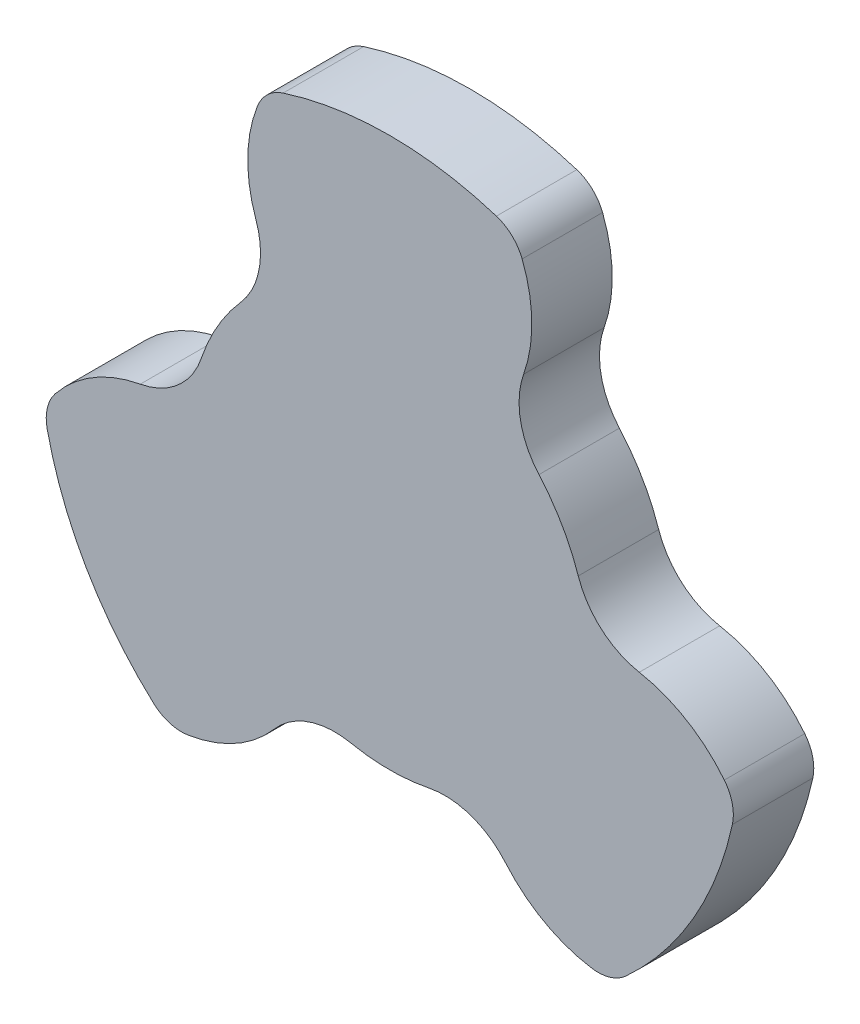
ISO-10303-21;
HEADER;
FILE_DESCRIPTION(('STEP AP214'),'2;1');
FILE_NAME('part.step','',(''),(''),'','','');
FILE_SCHEMA(('AUTOMOTIVE_DESIGN { 1 0 10303 214 1 1 1 1 }'));
ENDSEC;
DATA;
#1=APPLICATION_CONTEXT('core data for automotive mechanical design processes');
#2=APPLICATION_PROTOCOL_DEFINITION('international standard','automotive_design',2000,#1);
#3=PRODUCT_CONTEXT('',#1,'mechanical');
#4=PRODUCT('Part','Part','',(#3));
#5=PRODUCT_RELATED_PRODUCT_CATEGORY('part','',(#4));
#6=PRODUCT_DEFINITION_FORMATION('','',#4);
#7=PRODUCT_DEFINITION_CONTEXT('part definition',#1,'design');
#8=PRODUCT_DEFINITION('design','',#6,#7);
#9=PRODUCT_DEFINITION_SHAPE('','',#8);
#10=(LENGTH_UNIT() NAMED_UNIT(*) SI_UNIT(.MILLI.,.METRE.));
#11=(NAMED_UNIT(*) PLANE_ANGLE_UNIT() SI_UNIT($,.RADIAN.));
#12=(NAMED_UNIT(*) SI_UNIT($,.STERADIAN.) SOLID_ANGLE_UNIT());
#13=UNCERTAINTY_MEASURE_WITH_UNIT(LENGTH_MEASURE(1.E-05),#10,'distance_accuracy_value','');
#14=(GEOMETRIC_REPRESENTATION_CONTEXT(3) GLOBAL_UNCERTAINTY_ASSIGNED_CONTEXT((#13)) GLOBAL_UNIT_ASSIGNED_CONTEXT((#10,
#11,#12)) REPRESENTATION_CONTEXT('',''));
#15=CARTESIAN_POINT('',(0.,0.,0.));
#16=DIRECTION('',(0.,0.,1.));
#17=DIRECTION('',(1.,0.,0.));
#18=AXIS2_PLACEMENT_3D('',#15,#16,#17);
#19=CARTESIAN_POINT('',(17.9550527785572,-21.1043190536919,6.35));
#20=DIRECTION('',(0.,0.,-1.));
#21=DIRECTION('',(-1.,0.,0.));
#22=AXIS2_PLACEMENT_3D('',#19,#20,#21);
#23=CYLINDRICAL_SURFACE('',#22,6.2865);
#24=CARTESIAN_POINT('',(17.9550527785572,-21.1043190536919,0.));
#25=DIRECTION('',(0.,0.,1.));
#26=DIRECTION('',(1.,0.,0.));
#27=AXIS2_PLACEMENT_3D('',#24,#25,#26);
#28=CIRCLE('',#27,6.2865);
#29=CARTESIAN_POINT('',(19.0955836098733,-27.2864927549735,0.));
#30=VERTEX_POINT('',#29);
#31=CARTESIAN_POINT('',(23.9132782704228,-23.1092208562955,0.));
#32=VERTEX_POINT('',#31);
#33=EDGE_CURVE('E245',#30,#32,#28,.T.);
#34=ORIENTED_EDGE('',*,*,#33,.F.);
#35=DIRECTION('',(0.,0.,-1.));
#36=VECTOR('',#35,1.);
#37=CARTESIAN_POINT('',(19.0955836098733,-27.2864927549735,6.35));
#38=LINE('',#37,#36);
#39=CARTESIAN_POINT('',(19.0955836098733,-27.2864927549735,6.35));
#40=VERTEX_POINT('',#39);
#41=EDGE_CURVE('E11',#40,#30,#38,.T.);
#42=ORIENTED_EDGE('',*,*,#41,.F.);
#43=CARTESIAN_POINT('',(17.9550527785572,-21.1043190536919,6.35));
#44=DIRECTION('',(0.,0.,1.));
#45=DIRECTION('',(1.,0.,0.));
#46=AXIS2_PLACEMENT_3D('',#43,#44,#45);
#47=CIRCLE('',#46,6.2865);
#48=CARTESIAN_POINT('',(23.9132782704228,-23.1092208562955,6.35));
#49=VERTEX_POINT('',#48);
#50=EDGE_CURVE('E326',#40,#49,#47,.T.);
#51=ORIENTED_EDGE('',*,*,#50,.T.);
#52=DIRECTION('',(0.,0.,-1.));
#53=VECTOR('',#52,1.);
#54=CARTESIAN_POINT('',(23.9132782704228,-23.1092208562955,6.35));
#55=LINE('',#54,#53);
#56=EDGE_CURVE('E48',#49,#32,#55,.T.);
#57=ORIENTED_EDGE('',*,*,#56,.T.);
#58=EDGE_LOOP('',(#34,#42,#51,#57));
#59=FACE_BOUND('',#58,.T.);
#60=ADVANCED_FACE('F45',(#59),#23,.F.);
#61=CARTESIAN_POINT('',(21.1301062847261,-38.3144914988759,6.35));
#62=DIRECTION('',(0.,0.,-1.));
#63=DIRECTION('',(-1.,0.,0.));
#64=AXIS2_PLACEMENT_3D('',#61,#62,#63);
#65=CYLINDRICAL_SURFACE('',#64,11.2141000000001);
#66=CARTESIAN_POINT('',(21.1301062847261,-38.3144914988759,0.));
#67=DIRECTION('',(0.,0.,1.));
#68=DIRECTION('',(1.,0.,0.));
#69=AXIS2_PLACEMENT_3D('',#66,#67,#68);
#70=CIRCLE('',#69,11.2141000000001);
#71=CARTESIAN_POINT('',(12.3809762596504,-31.2995957324142,0.));
#72=VERTEX_POINT('',#71);
#73=EDGE_CURVE('E139',#30,#72,#70,.T.);
#74=ORIENTED_EDGE('',*,*,#73,.T.);
#75=DIRECTION('',(0.,0.,-1.));
#76=VECTOR('',#75,1.);
#77=CARTESIAN_POINT('',(12.3809762596504,-31.2995957324142,6.35));
#78=LINE('',#77,#76);
#79=CARTESIAN_POINT('',(12.3809762596504,-31.2995957324142,6.35));
#80=VERTEX_POINT('',#79);
#81=EDGE_CURVE('E55',#80,#72,#78,.T.);
#82=ORIENTED_EDGE('',*,*,#81,.F.);
#83=CARTESIAN_POINT('',(21.1301062847261,-38.3144914988759,6.35));
#84=DIRECTION('',(0.,0.,1.));
#85=DIRECTION('',(1.,0.,0.));
#86=AXIS2_PLACEMENT_3D('',#83,#84,#85);
#87=CIRCLE('',#86,11.2141000000001);
#88=EDGE_CURVE('E218',#40,#80,#87,.T.);
#89=ORIENTED_EDGE('',*,*,#88,.F.);
#90=ORIENTED_EDGE('',*,*,#41,.T.);
#91=EDGE_LOOP('',(#74,#82,#89,#90));
#92=FACE_BOUND('',#91,.T.);
#93=ADVANCED_FACE('F559',(#92),#65,.T.);
#94=CARTESIAN_POINT('',(14.9076219633811,-33.3254150081194,6.35));
#95=DIRECTION('',(0.,0.,-1.));
#96=DIRECTION('',(-1.,0.,0.));
#97=AXIS2_PLACEMENT_3D('',#94,#95,#96);
#98=CYLINDRICAL_SURFACE('',#97,3.2385);
#99=CARTESIAN_POINT('',(14.9076219633811,-33.3254150081194,0.));
#100=DIRECTION('',(0.,0.,1.));
#101=DIRECTION('',(1.,0.,0.));
#102=AXIS2_PLACEMENT_3D('',#99,#100,#101);
#103=CIRCLE('',#102,3.2385);
#104=CARTESIAN_POINT('',(11.7434876912703,-34.0154414989543,0.));
#105=VERTEX_POINT('',#104);
#106=EDGE_CURVE('E226',#72,#105,#103,.T.);
#107=ORIENTED_EDGE('',*,*,#106,.T.);
#108=DIRECTION('',(0.,0.,-1.));
#109=VECTOR('',#108,1.);
#110=CARTESIAN_POINT('',(11.7434876912703,-34.0154414989543,6.35));
#111=LINE('',#110,#109);
#112=CARTESIAN_POINT('',(11.7434876912703,-34.0154414989543,6.35));
#113=VERTEX_POINT('',#112);
#114=EDGE_CURVE('E223',#113,#105,#111,.T.);
#115=ORIENTED_EDGE('',*,*,#114,.F.);
#116=CARTESIAN_POINT('',(14.9076219633811,-33.3254150081194,6.35));
#117=DIRECTION('',(0.,0.,1.));
#118=DIRECTION('',(1.,0.,0.));
#119=AXIS2_PLACEMENT_3D('',#116,#117,#118);
#120=CIRCLE('',#119,3.2385);
#121=EDGE_CURVE('E212',#80,#113,#120,.T.);
#122=ORIENTED_EDGE('',*,*,#121,.F.);
#123=ORIENTED_EDGE('',*,*,#81,.T.);
#124=EDGE_LOOP('',(#107,#115,#122,#123));
#125=FACE_BOUND('',#124,.T.);
#126=ADVANCED_FACE('F224',(#125),#98,.T.);
#127=CARTESIAN_POINT('',(38.793733625394,-28.116391498876,6.35));
#128=DIRECTION('',(0.,0.,-1.));
#129=DIRECTION('',(-1.,0.,0.));
#130=AXIS2_PLACEMENT_3D('',#127,#128,#129);
#131=CYLINDRICAL_SURFACE('',#130,27.686);
#132=CARTESIAN_POINT('',(38.793733625394,-28.116391498876,0.));
#133=DIRECTION('',(0.,0.,1.));
#134=DIRECTION('',(1.,0.,0.));
#135=AXIS2_PLACEMENT_3D('',#132,#133,#134);
#136=CIRCLE('',#135,27.686);
#137=CARTESIAN_POINT('',(20.1598835000698,-48.5930666564047,0.));
#138=VERTEX_POINT('',#137);
#139=EDGE_CURVE('E320',#105,#138,#136,.T.);
#140=ORIENTED_EDGE('',*,*,#139,.T.);
#141=DIRECTION('',(0.,0.,-1.));
#142=VECTOR('',#141,1.);
#143=CARTESIAN_POINT('',(20.1598835000698,-48.5930666564047,6.35));
#144=LINE('',#143,#142);
#145=CARTESIAN_POINT('',(20.1598835000698,-48.5930666564047,6.35));
#146=VERTEX_POINT('',#145);
#147=EDGE_CURVE('E230',#146,#138,#144,.T.);
#148=ORIENTED_EDGE('',*,*,#147,.F.);
#149=CARTESIAN_POINT('',(38.793733625394,-28.116391498876,6.35));
#150=DIRECTION('',(0.,0.,1.));
#151=DIRECTION('',(1.,0.,0.));
#152=AXIS2_PLACEMENT_3D('',#149,#150,#151);
#153=CIRCLE('',#152,27.686);
#154=EDGE_CURVE('E216',#113,#146,#153,.T.);
#155=ORIENTED_EDGE('',*,*,#154,.F.);
#156=ORIENTED_EDGE('',*,*,#114,.T.);
#157=EDGE_LOOP('',(#140,#148,#155,#156));
#158=FACE_BOUND('',#157,.T.);
#159=ADVANCED_FACE('F232',(#158),#131,.T.);
#160=CARTESIAN_POINT('',(22.3395311064724,-46.1978592411892,6.35));
#161=DIRECTION('',(0.,0.,-1.));
#162=DIRECTION('',(-1.,0.,0.));
#163=AXIS2_PLACEMENT_3D('',#160,#161,#162);
#164=CYLINDRICAL_SURFACE('',#163,3.2385);
#165=CARTESIAN_POINT('',(22.3395311064724,-46.1978592411892,0.));
#166=DIRECTION('',(0.,0.,1.));
#167=DIRECTION('',(1.,0.,0.));
#168=AXIS2_PLACEMENT_3D('',#165,#166,#167);
#169=CIRCLE('',#168,3.2385);
#170=CARTESIAN_POINT('',(22.830619210844,-49.3989082448355,0.));
#171=VERTEX_POINT('',#170);
#172=EDGE_CURVE('E317',#138,#171,#169,.T.);
#173=ORIENTED_EDGE('',*,*,#172,.T.);
#174=DIRECTION('',(0.,0.,-1.));
#175=VECTOR('',#174,1.);
#176=CARTESIAN_POINT('',(22.830619210844,-49.3989082448355,6.35));
#177=LINE('',#176,#175);
#178=CARTESIAN_POINT('',(22.830619210844,-49.3989082448355,6.35));
#179=VERTEX_POINT('',#178);
#180=EDGE_CURVE('E332',#179,#171,#177,.T.);
#181=ORIENTED_EDGE('',*,*,#180,.F.);
#182=CARTESIAN_POINT('',(22.3395311064724,-46.1978592411892,6.35));
#183=DIRECTION('',(0.,0.,1.));
#184=DIRECTION('',(1.,0.,0.));
#185=AXIS2_PLACEMENT_3D('',#182,#183,#184);
#186=CIRCLE('',#185,3.2385);
#187=EDGE_CURVE('E236',#146,#179,#186,.T.);
#188=ORIENTED_EDGE('',*,*,#187,.F.);
#189=ORIENTED_EDGE('',*,*,#147,.T.);
#190=EDGE_LOOP('',(#173,#181,#188,#189));
#191=FACE_BOUND('',#190,.T.);
#192=ADVANCED_FACE('F406',(#191),#164,.T.);
#193=CARTESIAN_POINT('',(21.1301062847261,-38.3144914988759,6.35));
#194=DIRECTION('',(0.,0.,-1.));
#195=DIRECTION('',(-1.,0.,0.));
#196=AXIS2_PLACEMENT_3D('',#193,#194,#195);
#197=CYLINDRICAL_SURFACE('',#196,11.2141000000001);
#198=CARTESIAN_POINT('',(21.1301062847261,-38.3144914988759,0.));
#199=DIRECTION('',(0.,0.,1.));
#200=DIRECTION('',(1.,0.,0.));
#201=AXIS2_PLACEMENT_3D('',#198,#199,#200);
#202=CIRCLE('',#201,11.2141000000001);
#203=CARTESIAN_POINT('',(29.663372012422,-45.5904391918251,0.));
#204=VERTEX_POINT('',#203);
#205=EDGE_CURVE('E313',#171,#204,#202,.T.);
#206=ORIENTED_EDGE('',*,*,#205,.T.);
#207=DIRECTION('',(0.,0.,-1.));
#208=VECTOR('',#207,1.);
#209=CARTESIAN_POINT('',(29.663372012422,-45.5904391918251,6.35));
#210=LINE('',#209,#208);
#211=CARTESIAN_POINT('',(29.663372012422,-45.5904391918251,6.35));
#212=VERTEX_POINT('',#211);
#213=EDGE_CURVE('E336',#212,#204,#210,.T.);
#214=ORIENTED_EDGE('',*,*,#213,.F.);
#215=CARTESIAN_POINT('',(21.1301062847261,-38.3144914988759,6.35));
#216=DIRECTION('',(0.,0.,1.));
#217=DIRECTION('',(1.,0.,0.));
#218=AXIS2_PLACEMENT_3D('',#215,#216,#217);
#219=CIRCLE('',#218,11.2141000000001);
#220=EDGE_CURVE('E239',#179,#212,#219,.T.);
#221=ORIENTED_EDGE('',*,*,#220,.F.);
#222=ORIENTED_EDGE('',*,*,#180,.T.);
#223=EDGE_LOOP('',(#206,#214,#221,#222));
#224=FACE_BOUND('',#223,.T.);
#225=ADVANCED_FACE('F415',(#224),#197,.T.);
#226=CARTESIAN_POINT('',(34.4470260726819,-49.6692547161849,6.35));
#227=DIRECTION('',(0.,0.,-1.));
#228=DIRECTION('',(-1.,0.,0.));
#229=AXIS2_PLACEMENT_3D('',#226,#227,#228);
#230=CYLINDRICAL_SURFACE('',#229,6.28649999999999);
#231=CARTESIAN_POINT('',(34.4470260726819,-49.6692547161849,0.));
#232=DIRECTION('',(0.,0.,1.));
#233=DIRECTION('',(1.,0.,0.));
#234=AXIS2_PLACEMENT_3D('',#231,#232,#233);
#235=CIRCLE('',#234,6.28649999999999);
#236=CARTESIAN_POINT('',(35.6898429254668,-43.5068291774515,0.));
#237=VERTEX_POINT('',#236);
#238=EDGE_CURVE('E309',#237,#204,#235,.T.);
#239=ORIENTED_EDGE('',*,*,#238,.F.);
#240=DIRECTION('',(0.,0.,-1.));
#241=VECTOR('',#240,1.);
#242=CARTESIAN_POINT('',(35.6898429254668,-43.5068291774515,6.35));
#243=LINE('',#242,#241);
#244=CARTESIAN_POINT('',(35.6898429254668,-43.5068291774515,6.35));
#245=VERTEX_POINT('',#244);
#246=EDGE_CURVE('E339',#245,#237,#243,.T.);
#247=ORIENTED_EDGE('',*,*,#246,.F.);
#248=CARTESIAN_POINT('',(34.4470260726819,-49.6692547161849,6.35));
#249=DIRECTION('',(0.,0.,1.));
#250=DIRECTION('',(1.,0.,0.));
#251=AXIS2_PLACEMENT_3D('',#248,#249,#250);
#252=CIRCLE('',#251,6.28649999999999);
#253=EDGE_CURVE('E412',#245,#212,#252,.T.);
#254=ORIENTED_EDGE('',*,*,#253,.T.);
#255=ORIENTED_EDGE('',*,*,#213,.T.);
#256=EDGE_LOOP('',(#239,#247,#254,#255));
#257=FACE_BOUND('',#256,.T.);
#258=ADVANCED_FACE('F418',(#257),#230,.F.);
#259=CARTESIAN_POINT('',(38.793733625394,-28.116391498876,6.35));
#260=DIRECTION('',(0.,0.,-1.));
#261=DIRECTION('',(-1.,0.,0.));
#262=AXIS2_PLACEMENT_3D('',#259,#260,#261);
#263=CYLINDRICAL_SURFACE('',#262,15.700309214);
#264=CARTESIAN_POINT('',(38.793733625394,-28.116391498876,0.));
#265=DIRECTION('',(0.,0.,1.));
#266=DIRECTION('',(1.,0.,0.));
#267=AXIS2_PLACEMENT_3D('',#264,#265,#266);
#268=CIRCLE('',#267,15.700309214);
#269=CARTESIAN_POINT('',(41.8976243253214,-43.5068291774515,0.));
#270=VERTEX_POINT('',#269);
#271=EDGE_CURVE('E305',#237,#270,#268,.T.);
#272=ORIENTED_EDGE('',*,*,#271,.T.);
#273=DIRECTION('',(0.,0.,-1.));
#274=VECTOR('',#273,1.);
#275=CARTESIAN_POINT('',(41.8976243253214,-43.5068291774515,6.35));
#276=LINE('',#275,#274);
#277=CARTESIAN_POINT('',(41.8976243253214,-43.5068291774515,6.35));
#278=VERTEX_POINT('',#277);
#279=EDGE_CURVE('E342',#278,#270,#276,.T.);
#280=ORIENTED_EDGE('',*,*,#279,.F.);
#281=CARTESIAN_POINT('',(38.793733625394,-28.116391498876,6.35));
#282=DIRECTION('',(0.,0.,1.));
#283=DIRECTION('',(1.,0.,0.));
#284=AXIS2_PLACEMENT_3D('',#281,#282,#283);
#285=CIRCLE('',#284,15.700309214);
#286=EDGE_CURVE('E421',#245,#278,#285,.T.);
#287=ORIENTED_EDGE('',*,*,#286,.F.);
#288=ORIENTED_EDGE('',*,*,#246,.T.);
#289=EDGE_LOOP('',(#272,#280,#287,#288));
#290=FACE_BOUND('',#289,.T.);
#291=ADVANCED_FACE('F548',(#290),#263,.T.);
#292=CARTESIAN_POINT('',(43.1404411781063,-49.6692547161849,6.35));
#293=DIRECTION('',(0.,0.,-1.));
#294=DIRECTION('',(-1.,0.,0.));
#295=AXIS2_PLACEMENT_3D('',#292,#293,#294);
#296=CYLINDRICAL_SURFACE('',#295,6.2865);
#297=CARTESIAN_POINT('',(43.1404411781063,-49.6692547161849,0.));
#298=DIRECTION('',(0.,0.,1.));
#299=DIRECTION('',(1.,0.,0.));
#300=AXIS2_PLACEMENT_3D('',#297,#298,#299);
#301=CIRCLE('',#300,6.2865);
#302=CARTESIAN_POINT('',(47.9240952383662,-45.590439191825,0.));
#303=VERTEX_POINT('',#302);
#304=EDGE_CURVE('E301',#303,#270,#301,.T.);
#305=ORIENTED_EDGE('',*,*,#304,.F.);
#306=DIRECTION('',(0.,0.,-1.));
#307=VECTOR('',#306,1.);
#308=CARTESIAN_POINT('',(47.9240952383662,-45.590439191825,6.35));
#309=LINE('',#308,#307);
#310=CARTESIAN_POINT('',(47.9240952383662,-45.590439191825,6.35));
#311=VERTEX_POINT('',#310);
#312=EDGE_CURVE('E345',#311,#303,#309,.T.);
#313=ORIENTED_EDGE('',*,*,#312,.F.);
#314=CARTESIAN_POINT('',(43.1404411781063,-49.6692547161849,6.35));
#315=DIRECTION('',(0.,0.,1.));
#316=DIRECTION('',(1.,0.,0.));
#317=AXIS2_PLACEMENT_3D('',#314,#315,#316);
#318=CIRCLE('',#317,6.2865);
#319=EDGE_CURVE('E424',#311,#278,#318,.T.);
#320=ORIENTED_EDGE('',*,*,#319,.T.);
#321=ORIENTED_EDGE('',*,*,#279,.T.);
#322=EDGE_LOOP('',(#305,#313,#320,#321));
#323=FACE_BOUND('',#322,.T.);
#324=ADVANCED_FACE('F543',(#323),#296,.F.);
#325=CARTESIAN_POINT('',(56.4573609660622,-38.3144914988759,6.35));
#326=DIRECTION('',(0.,0.,-1.));
#327=DIRECTION('',(-1.,0.,0.));
#328=AXIS2_PLACEMENT_3D('',#325,#326,#327);
#329=CYLINDRICAL_SURFACE('',#328,11.2141000000001);
#330=CARTESIAN_POINT('',(56.4573609660622,-38.3144914988759,0.));
#331=DIRECTION('',(0.,0.,1.));
#332=DIRECTION('',(1.,0.,0.));
#333=AXIS2_PLACEMENT_3D('',#330,#331,#332);
#334=CIRCLE('',#333,11.2141000000001);
#335=CARTESIAN_POINT('',(54.756848039944,-49.3989082448354,0.));
#336=VERTEX_POINT('',#335);
#337=EDGE_CURVE('E298',#303,#336,#334,.T.);
#338=ORIENTED_EDGE('',*,*,#337,.T.);
#339=DIRECTION('',(0.,0.,-1.));
#340=VECTOR('',#339,1.);
#341=CARTESIAN_POINT('',(54.756848039944,-49.3989082448354,6.35));
#342=LINE('',#341,#340);
#343=CARTESIAN_POINT('',(54.756848039944,-49.3989082448354,6.35));
#344=VERTEX_POINT('',#343);
#345=EDGE_CURVE('E348',#344,#336,#342,.T.);
#346=ORIENTED_EDGE('',*,*,#345,.F.);
#347=CARTESIAN_POINT('',(56.4573609660622,-38.3144914988759,6.35));
#348=DIRECTION('',(0.,0.,1.));
#349=DIRECTION('',(1.,0.,0.));
#350=AXIS2_PLACEMENT_3D('',#347,#348,#349);
#351=CIRCLE('',#350,11.2141000000001);
#352=EDGE_CURVE('E430',#311,#344,#351,.T.);
#353=ORIENTED_EDGE('',*,*,#352,.F.);
#354=ORIENTED_EDGE('',*,*,#312,.T.);
#355=EDGE_LOOP('',(#338,#346,#353,#354));
#356=FACE_BOUND('',#355,.T.);
#357=ADVANCED_FACE('F549',(#356),#329,.T.);
#358=CARTESIAN_POINT('',(55.2479361443156,-46.1978592411892,6.35));
#359=DIRECTION('',(0.,0.,-1.));
#360=DIRECTION('',(-1.,0.,0.));
#361=AXIS2_PLACEMENT_3D('',#358,#359,#360);
#362=CYLINDRICAL_SURFACE('',#361,3.23849999999998);
#363=CARTESIAN_POINT('',(55.2479361443156,-46.1978592411892,0.));
#364=DIRECTION('',(0.,0.,1.));
#365=DIRECTION('',(1.,0.,0.));
#366=AXIS2_PLACEMENT_3D('',#363,#364,#365);
#367=CIRCLE('',#366,3.23849999999998);
#368=CARTESIAN_POINT('',(57.4275837507182,-48.5930666564047,0.));
#369=VERTEX_POINT('',#368);
#370=EDGE_CURVE('E295',#336,#369,#367,.T.);
#371=ORIENTED_EDGE('',*,*,#370,.T.);
#372=DIRECTION('',(0.,0.,-1.));
#373=VECTOR('',#372,1.);
#374=CARTESIAN_POINT('',(57.4275837507182,-48.5930666564047,6.35));
#375=LINE('',#374,#373);
#376=CARTESIAN_POINT('',(57.4275837507182,-48.5930666564047,6.35));
#377=VERTEX_POINT('',#376);
#378=EDGE_CURVE('E352',#377,#369,#375,.T.);
#379=ORIENTED_EDGE('',*,*,#378,.F.);
#380=CARTESIAN_POINT('',(55.2479361443156,-46.1978592411892,6.35));
#381=DIRECTION('',(0.,0.,1.));
#382=DIRECTION('',(1.,0.,0.));
#383=AXIS2_PLACEMENT_3D('',#380,#381,#382);
#384=CIRCLE('',#383,3.23849999999998);
#385=EDGE_CURVE('E433',#344,#377,#384,.T.);
#386=ORIENTED_EDGE('',*,*,#385,.F.);
#387=ORIENTED_EDGE('',*,*,#345,.T.);
#388=EDGE_LOOP('',(#371,#379,#386,#387));
#389=FACE_BOUND('',#388,.T.);
#390=ADVANCED_FACE('F536',(#389),#362,.T.);
#391=CARTESIAN_POINT('',(38.793733625394,-28.116391498876,6.35));
#392=DIRECTION('',(0.,0.,-1.));
#393=DIRECTION('',(-1.,0.,0.));
#394=AXIS2_PLACEMENT_3D('',#391,#392,#393);
#395=CYLINDRICAL_SURFACE('',#394,27.686);
#396=CARTESIAN_POINT('',(38.793733625394,-28.116391498876,0.));
#397=DIRECTION('',(0.,0.,1.));
#398=DIRECTION('',(1.,0.,0.));
#399=AXIS2_PLACEMENT_3D('',#396,#397,#398);
#400=CIRCLE('',#399,27.686);
#401=CARTESIAN_POINT('',(65.8439795595178,-34.015441498954,0.));
#402=VERTEX_POINT('',#401);
#403=EDGE_CURVE('E292',#369,#402,#400,.T.);
#404=ORIENTED_EDGE('',*,*,#403,.T.);
#405=DIRECTION('',(0.,0.,-1.));
#406=VECTOR('',#405,1.);
#407=CARTESIAN_POINT('',(65.8439795595178,-34.015441498954,6.35));
#408=LINE('',#407,#406);
#409=CARTESIAN_POINT('',(65.8439795595178,-34.015441498954,6.35));
#410=VERTEX_POINT('',#409);
#411=EDGE_CURVE('E356',#410,#402,#408,.T.);
#412=ORIENTED_EDGE('',*,*,#411,.F.);
#413=CARTESIAN_POINT('',(38.793733625394,-28.116391498876,6.35));
#414=DIRECTION('',(0.,0.,1.));
#415=DIRECTION('',(1.,0.,0.));
#416=AXIS2_PLACEMENT_3D('',#413,#414,#415);
#417=CIRCLE('',#416,27.686);
#418=EDGE_CURVE('E436',#377,#410,#417,.T.);
#419=ORIENTED_EDGE('',*,*,#418,.F.);
#420=ORIENTED_EDGE('',*,*,#378,.T.);
#421=EDGE_LOOP('',(#404,#412,#419,#420));
#422=FACE_BOUND('',#421,.T.);
#423=ADVANCED_FACE('F532',(#422),#395,.T.);
#424=CARTESIAN_POINT('',(62.6798452874069,-33.3254150081192,6.35));
#425=DIRECTION('',(0.,0.,-1.));
#426=DIRECTION('',(-1.,0.,0.));
#427=AXIS2_PLACEMENT_3D('',#424,#425,#426);
#428=CYLINDRICAL_SURFACE('',#427,3.23849999999999);
#429=CARTESIAN_POINT('',(62.6798452874069,-33.3254150081192,0.));
#430=DIRECTION('',(0.,0.,1.));
#431=DIRECTION('',(1.,0.,0.));
#432=AXIS2_PLACEMENT_3D('',#429,#430,#431);
#433=CIRCLE('',#432,3.23849999999999);
#434=CARTESIAN_POINT('',(65.2064909911376,-31.2995957324139,0.));
#435=VERTEX_POINT('',#434);
#436=EDGE_CURVE('E289',#402,#435,#433,.T.);
#437=ORIENTED_EDGE('',*,*,#436,.T.);
#438=DIRECTION('',(0.,0.,-1.));
#439=VECTOR('',#438,1.);
#440=CARTESIAN_POINT('',(65.2064909911376,-31.2995957324139,6.35));
#441=LINE('',#440,#439);
#442=CARTESIAN_POINT('',(65.2064909911376,-31.2995957324139,6.35));
#443=VERTEX_POINT('',#442);
#444=EDGE_CURVE('E360',#443,#435,#441,.T.);
#445=ORIENTED_EDGE('',*,*,#444,.F.);
#446=CARTESIAN_POINT('',(62.6798452874069,-33.3254150081192,6.35));
#447=DIRECTION('',(0.,0.,1.));
#448=DIRECTION('',(1.,0.,0.));
#449=AXIS2_PLACEMENT_3D('',#446,#447,#448);
#450=CIRCLE('',#449,3.23849999999999);
#451=EDGE_CURVE('E439',#410,#443,#450,.T.);
#452=ORIENTED_EDGE('',*,*,#451,.F.);
#453=ORIENTED_EDGE('',*,*,#411,.T.);
#454=EDGE_LOOP('',(#437,#445,#452,#453));
#455=FACE_BOUND('',#454,.T.);
#456=ADVANCED_FACE('F527',(#455),#428,.T.);
#457=CARTESIAN_POINT('',(56.4573609660622,-38.3144914988759,6.35));
#458=DIRECTION('',(0.,0.,-1.));
#459=DIRECTION('',(-1.,0.,0.));
#460=AXIS2_PLACEMENT_3D('',#457,#458,#459);
#461=CYLINDRICAL_SURFACE('',#460,11.2141000000001);
#462=CARTESIAN_POINT('',(56.4573609660622,-38.3144914988759,0.));
#463=DIRECTION('',(0.,0.,1.));
#464=DIRECTION('',(1.,0.,0.));
#465=AXIS2_PLACEMENT_3D('',#462,#463,#464);
#466=CIRCLE('',#465,11.2141000000001);
#467=CARTESIAN_POINT('',(58.4918836409148,-27.2864927549735,0.));
#468=VERTEX_POINT('',#467);
#469=EDGE_CURVE('E285',#435,#468,#466,.T.);
#470=ORIENTED_EDGE('',*,*,#469,.T.);
#471=DIRECTION('',(0.,0.,-1.));
#472=VECTOR('',#471,1.);
#473=CARTESIAN_POINT('',(58.4918836409148,-27.2864927549735,6.35));
#474=LINE('',#473,#472);
#475=CARTESIAN_POINT('',(58.4918836409148,-27.2864927549735,6.35));
#476=VERTEX_POINT('',#475);
#477=EDGE_CURVE('E364',#476,#468,#474,.T.);
#478=ORIENTED_EDGE('',*,*,#477,.F.);
#479=CARTESIAN_POINT('',(56.4573609660622,-38.3144914988759,6.35));
#480=DIRECTION('',(0.,0.,1.));
#481=DIRECTION('',(1.,0.,0.));
#482=AXIS2_PLACEMENT_3D('',#479,#480,#481);
#483=CIRCLE('',#482,11.2141000000001);
#484=EDGE_CURVE('E442',#443,#476,#483,.T.);
#485=ORIENTED_EDGE('',*,*,#484,.F.);
#486=ORIENTED_EDGE('',*,*,#444,.T.);
#487=EDGE_LOOP('',(#470,#478,#485,#486));
#488=FACE_BOUND('',#487,.T.);
#489=ADVANCED_FACE('F521',(#488),#461,.T.);
#490=CARTESIAN_POINT('',(59.6324144722308,-21.1043190536919,6.35));
#491=DIRECTION('',(0.,0.,-1.));
#492=DIRECTION('',(-1.,0.,0.));
#493=AXIS2_PLACEMENT_3D('',#490,#491,#492);
#494=CYLINDRICAL_SURFACE('',#493,6.2865);
#495=CARTESIAN_POINT('',(59.6324144722308,-21.1043190536919,0.));
#496=DIRECTION('',(0.,0.,1.));
#497=DIRECTION('',(1.,0.,0.));
#498=AXIS2_PLACEMENT_3D('',#495,#496,#497);
#499=CIRCLE('',#498,6.2865);
#500=CARTESIAN_POINT('',(53.6741889803653,-23.1092208562955,0.));
#501=VERTEX_POINT('',#500);
#502=EDGE_CURVE('E281',#501,#468,#499,.T.);
#503=ORIENTED_EDGE('',*,*,#502,.F.);
#504=DIRECTION('',(0.,0.,-1.));
#505=VECTOR('',#504,1.);
#506=CARTESIAN_POINT('',(53.6741889803653,-23.1092208562955,6.35));
#507=LINE('',#506,#505);
#508=CARTESIAN_POINT('',(53.6741889803653,-23.1092208562955,6.35));
#509=VERTEX_POINT('',#508);
#510=EDGE_CURVE('E367',#509,#501,#507,.T.);
#511=ORIENTED_EDGE('',*,*,#510,.F.);
#512=CARTESIAN_POINT('',(59.6324144722308,-21.1043190536919,6.35));
#513=DIRECTION('',(0.,0.,1.));
#514=DIRECTION('',(1.,0.,0.));
#515=AXIS2_PLACEMENT_3D('',#512,#513,#514);
#516=CIRCLE('',#515,6.2865);
#517=EDGE_CURVE('E445',#509,#476,#516,.T.);
#518=ORIENTED_EDGE('',*,*,#517,.T.);
#519=ORIENTED_EDGE('',*,*,#477,.T.);
#520=EDGE_LOOP('',(#503,#511,#518,#519));
#521=FACE_BOUND('',#520,.T.);
#522=ADVANCED_FACE('F516',(#521),#494,.F.);
#523=CARTESIAN_POINT('',(38.793733625394,-28.116391498876,6.35));
#524=DIRECTION('',(0.,0.,-1.));
#525=DIRECTION('',(-1.,0.,0.));
#526=AXIS2_PLACEMENT_3D('',#523,#524,#525);
#527=CYLINDRICAL_SURFACE('',#526,15.700309214);
#528=CARTESIAN_POINT('',(38.793733625394,-28.116391498876,0.));
#529=DIRECTION('',(0.,0.,1.));
#530=DIRECTION('',(1.,0.,0.));
#531=AXIS2_PLACEMENT_3D('',#528,#529,#530);
#532=CIRCLE('',#531,15.700309214);
#533=CARTESIAN_POINT('',(50.5702982804379,-17.7331244628809,0.));
#534=VERTEX_POINT('',#533);
#535=EDGE_CURVE('E277',#501,#534,#532,.T.);
#536=ORIENTED_EDGE('',*,*,#535,.T.);
#537=DIRECTION('',(0.,0.,-1.));
#538=VECTOR('',#537,1.);
#539=CARTESIAN_POINT('',(50.5702982804379,-17.7331244628809,6.35));
#540=LINE('',#539,#538);
#541=CARTESIAN_POINT('',(50.5702982804379,-17.7331244628809,6.35));
#542=VERTEX_POINT('',#541);
#543=EDGE_CURVE('E370',#542,#534,#540,.T.);
#544=ORIENTED_EDGE('',*,*,#543,.F.);
#545=CARTESIAN_POINT('',(38.793733625394,-28.116391498876,6.35));
#546=DIRECTION('',(0.,0.,1.));
#547=DIRECTION('',(1.,0.,0.));
#548=AXIS2_PLACEMENT_3D('',#545,#546,#547);
#549=CIRCLE('',#548,15.700309214);
#550=EDGE_CURVE('E449',#509,#542,#549,.T.);
#551=ORIENTED_EDGE('',*,*,#550,.F.);
#552=ORIENTED_EDGE('',*,*,#510,.T.);
#553=EDGE_LOOP('',(#536,#544,#551,#552));
#554=FACE_BOUND('',#553,.T.);
#555=ADVANCED_FACE('F512',(#554),#527,.T.);
#556=CARTESIAN_POINT('',(55.2857069195186,-13.575600726751,6.35));
#557=DIRECTION('',(0.,0.,-1.));
#558=DIRECTION('',(-1.,0.,0.));
#559=AXIS2_PLACEMENT_3D('',#556,#557,#558);
#560=CYLINDRICAL_SURFACE('',#559,6.2865);
#561=CARTESIAN_POINT('',(55.2857069195186,-13.575600726751,0.));
#562=DIRECTION('',(0.,0.,1.));
#563=DIRECTION('',(1.,0.,0.));
#564=AXIS2_PLACEMENT_3D('',#561,#562,#563);
#565=CIRCLE('',#564,6.2865);
#566=CARTESIAN_POINT('',(49.3615220279426,-11.4722425498293,0.));
#567=VERTEX_POINT('',#566);
#568=EDGE_CURVE('E273',#567,#534,#565,.T.);
#569=ORIENTED_EDGE('',*,*,#568,.F.);
#570=DIRECTION('',(0.,0.,-1.));
#571=VECTOR('',#570,1.);
#572=CARTESIAN_POINT('',(49.3615220279426,-11.4722425498293,6.35));
#573=LINE('',#572,#571);
#574=CARTESIAN_POINT('',(49.3615220279426,-11.4722425498293,6.35));
#575=VERTEX_POINT('',#574);
#576=EDGE_CURVE('E373',#575,#567,#573,.T.);
#577=ORIENTED_EDGE('',*,*,#576,.F.);
#578=CARTESIAN_POINT('',(55.2857069195186,-13.575600726751,6.35));
#579=DIRECTION('',(0.,0.,1.));
#580=DIRECTION('',(1.,0.,0.));
#581=AXIS2_PLACEMENT_3D('',#578,#579,#580);
#582=CIRCLE('',#581,6.2865);
#583=EDGE_CURVE('E452',#575,#542,#582,.T.);
#584=ORIENTED_EDGE('',*,*,#583,.T.);
#585=ORIENTED_EDGE('',*,*,#543,.T.);
#586=EDGE_LOOP('',(#569,#577,#584,#585));
#587=FACE_BOUND('',#586,.T.);
#588=ADVANCED_FACE('F506',(#587),#560,.F.);
#589=CARTESIAN_POINT('',(38.793733625394,-7.72019149887598,6.35));
#590=DIRECTION('',(0.,0.,-1.));
#591=DIRECTION('',(-1.,0.,0.));
#592=AXIS2_PLACEMENT_3D('',#589,#590,#591);
#593=CYLINDRICAL_SURFACE('',#592,11.2141);
#594=CARTESIAN_POINT('',(38.793733625394,-7.72019149887598,0.));
#595=DIRECTION('',(0.,0.,1.));
#596=DIRECTION('',(1.,0.,0.));
#597=AXIS2_PLACEMENT_3D('',#594,#595,#596);
#598=CIRCLE('',#597,11.2141);
#599=CARTESIAN_POINT('',(49.2433765765876,-3.6506705193784,0.));
#600=VERTEX_POINT('',#599);
#601=EDGE_CURVE('E270',#567,#600,#598,.T.);
#602=ORIENTED_EDGE('',*,*,#601,.T.);
#603=DIRECTION('',(0.,0.,-1.));
#604=VECTOR('',#603,1.);
#605=CARTESIAN_POINT('',(49.2433765765876,-3.6506705193784,6.35));
#606=LINE('',#605,#604);
#607=CARTESIAN_POINT('',(49.2433765765876,-3.6506705193784,6.35));
#608=VERTEX_POINT('',#607);
#609=EDGE_CURVE('E376',#608,#600,#606,.T.);
#610=ORIENTED_EDGE('',*,*,#609,.F.);
#611=CARTESIAN_POINT('',(38.793733625394,-7.72019149887598,6.35));
#612=DIRECTION('',(0.,0.,1.));
#613=DIRECTION('',(1.,0.,0.));
#614=AXIS2_PLACEMENT_3D('',#611,#612,#613);
#615=CIRCLE('',#614,11.2141);
#616=EDGE_CURVE('E456',#575,#608,#615,.T.);
#617=ORIENTED_EDGE('',*,*,#616,.F.);
#618=ORIENTED_EDGE('',*,*,#576,.T.);
#619=EDGE_LOOP('',(#602,#610,#617,#618));
#620=FACE_BOUND('',#619,.T.);
#621=ADVANCED_FACE('F649',(#620),#593,.T.);
#622=CARTESIAN_POINT('',(46.2256427684853,-4.82590024731938,6.35));
#623=DIRECTION('',(0.,0.,-1.));
#624=DIRECTION('',(-1.,0.,0.));
#625=AXIS2_PLACEMENT_3D('',#622,#623,#624);
#626=CYLINDRICAL_SURFACE('',#625,3.23850000000001);
#627=CARTESIAN_POINT('',(46.2256427684853,-4.82590024731938,0.));
#628=DIRECTION('',(0.,0.,1.));
#629=DIRECTION('',(1.,0.,0.));
#630=AXIS2_PLACEMENT_3D('',#627,#628,#629);
#631=CIRCLE('',#630,3.23850000000001);
#632=CARTESIAN_POINT('',(47.2101294341934,-1.74066634126901,0.));
#633=VERTEX_POINT('',#632);
#634=EDGE_CURVE('E267',#600,#633,#631,.T.);
#635=ORIENTED_EDGE('',*,*,#634,.T.);
#636=DIRECTION('',(0.,0.,-1.));
#637=VECTOR('',#636,1.);
#638=CARTESIAN_POINT('',(47.2101294341934,-1.74066634126901,6.35));
#639=LINE('',#638,#637);
#640=CARTESIAN_POINT('',(47.2101294341934,-1.74066634126901,6.35));
#641=VERTEX_POINT('',#640);
#642=EDGE_CURVE('E380',#641,#633,#639,.T.);
#643=ORIENTED_EDGE('',*,*,#642,.F.);
#644=CARTESIAN_POINT('',(46.2256427684853,-4.82590024731938,6.35));
#645=DIRECTION('',(0.,0.,1.));
#646=DIRECTION('',(1.,0.,0.));
#647=AXIS2_PLACEMENT_3D('',#644,#645,#646);
#648=CIRCLE('',#647,3.23850000000001);
#649=EDGE_CURVE('E459',#608,#641,#648,.T.);
#650=ORIENTED_EDGE('',*,*,#649,.F.);
#651=ORIENTED_EDGE('',*,*,#609,.T.);
#652=EDGE_LOOP('',(#635,#643,#650,#651));
#653=FACE_BOUND('',#652,.T.);
#654=ADVANCED_FACE('F499',(#653),#626,.T.);
#655=CARTESIAN_POINT('',(38.793733625394,-28.116391498876,6.35));
#656=DIRECTION('',(0.,0.,-1.));
#657=DIRECTION('',(-1.,0.,0.));
#658=AXIS2_PLACEMENT_3D('',#655,#656,#657);
#659=CYLINDRICAL_SURFACE('',#658,27.686);
#660=CARTESIAN_POINT('',(38.793733625394,-28.116391498876,0.));
#661=DIRECTION('',(0.,0.,1.));
#662=DIRECTION('',(1.,0.,0.));
#663=AXIS2_PLACEMENT_3D('',#660,#661,#662);
#664=CIRCLE('',#663,27.686);
#665=CARTESIAN_POINT('',(30.3773378165946,-1.74066634126901,0.));
#666=VERTEX_POINT('',#665);
#667=EDGE_CURVE('E264',#633,#666,#664,.T.);
#668=ORIENTED_EDGE('',*,*,#667,.T.);
#669=DIRECTION('',(0.,0.,-1.));
#670=VECTOR('',#669,1.);
#671=CARTESIAN_POINT('',(30.3773378165946,-1.74066634126901,6.35));
#672=LINE('',#671,#670);
#673=CARTESIAN_POINT('',(30.3773378165946,-1.74066634126901,6.35));
#674=VERTEX_POINT('',#673);
#675=EDGE_CURVE('E384',#674,#666,#672,.T.);
#676=ORIENTED_EDGE('',*,*,#675,.F.);
#677=CARTESIAN_POINT('',(38.793733625394,-28.116391498876,6.35));
#678=DIRECTION('',(0.,0.,1.));
#679=DIRECTION('',(1.,0.,0.));
#680=AXIS2_PLACEMENT_3D('',#677,#678,#679);
#681=CIRCLE('',#680,27.686);
#682=EDGE_CURVE('E462',#641,#674,#681,.T.);
#683=ORIENTED_EDGE('',*,*,#682,.F.);
#684=ORIENTED_EDGE('',*,*,#642,.T.);
#685=EDGE_LOOP('',(#668,#676,#683,#684));
#686=FACE_BOUND('',#685,.T.);
#687=ADVANCED_FACE('F495',(#686),#659,.T.);
#688=CARTESIAN_POINT('',(31.3618244823028,-4.82590024731938,6.35));
#689=DIRECTION('',(0.,0.,-1.));
#690=DIRECTION('',(-1.,0.,0.));
#691=AXIS2_PLACEMENT_3D('',#688,#689,#690);
#692=CYLINDRICAL_SURFACE('',#691,3.23850000000001);
#693=CARTESIAN_POINT('',(31.3618244823028,-4.82590024731938,0.));
#694=DIRECTION('',(0.,0.,1.));
#695=DIRECTION('',(1.,0.,0.));
#696=AXIS2_PLACEMENT_3D('',#693,#694,#695);
#697=CIRCLE('',#696,3.23850000000001);
#698=CARTESIAN_POINT('',(28.3440906742004,-3.6506705193784,0.));
#699=VERTEX_POINT('',#698);
#700=EDGE_CURVE('E261',#666,#699,#697,.T.);
#701=ORIENTED_EDGE('',*,*,#700,.T.);
#702=DIRECTION('',(0.,0.,-1.));
#703=VECTOR('',#702,1.);
#704=CARTESIAN_POINT('',(28.3440906742004,-3.6506705193784,6.35));
#705=LINE('',#704,#703);
#706=CARTESIAN_POINT('',(28.3440906742004,-3.6506705193784,6.35));
#707=VERTEX_POINT('',#706);
#708=EDGE_CURVE('E388',#707,#699,#705,.T.);
#709=ORIENTED_EDGE('',*,*,#708,.F.);
#710=CARTESIAN_POINT('',(31.3618244823028,-4.82590024731938,6.35));
#711=DIRECTION('',(0.,0.,1.));
#712=DIRECTION('',(1.,0.,0.));
#713=AXIS2_PLACEMENT_3D('',#710,#711,#712);
#714=CIRCLE('',#713,3.23850000000001);
#715=EDGE_CURVE('E465',#674,#707,#714,.T.);
#716=ORIENTED_EDGE('',*,*,#715,.F.);
#717=ORIENTED_EDGE('',*,*,#675,.T.);
#718=EDGE_LOOP('',(#701,#709,#716,#717));
#719=FACE_BOUND('',#718,.T.);
#720=ADVANCED_FACE('F491',(#719),#692,.T.);
#721=CARTESIAN_POINT('',(38.793733625394,-7.72019149887598,6.35));
#722=DIRECTION('',(0.,0.,-1.));
#723=DIRECTION('',(-1.,0.,0.));
#724=AXIS2_PLACEMENT_3D('',#721,#722,#723);
#725=CYLINDRICAL_SURFACE('',#724,11.2141);
#726=CARTESIAN_POINT('',(38.793733625394,-7.72019149887598,0.));
#727=DIRECTION('',(0.,0.,1.));
#728=DIRECTION('',(1.,0.,0.));
#729=AXIS2_PLACEMENT_3D('',#726,#727,#728);
#730=CIRCLE('',#729,11.2141);
#731=CARTESIAN_POINT('',(28.2259452228454,-11.4722425498293,0.));
#732=VERTEX_POINT('',#731);
#733=EDGE_CURVE('E257',#699,#732,#730,.T.);
#734=ORIENTED_EDGE('',*,*,#733,.T.);
#735=DIRECTION('',(0.,0.,-1.));
#736=VECTOR('',#735,1.);
#737=CARTESIAN_POINT('',(28.2259452228454,-11.4722425498293,6.35));
#738=LINE('',#737,#736);
#739=CARTESIAN_POINT('',(28.2259452228454,-11.4722425498293,6.35));
#740=VERTEX_POINT('',#739);
#741=EDGE_CURVE('E392',#740,#732,#738,.T.);
#742=ORIENTED_EDGE('',*,*,#741,.F.);
#743=CARTESIAN_POINT('',(38.793733625394,-7.72019149887598,6.35));
#744=DIRECTION('',(0.,0.,1.));
#745=DIRECTION('',(1.,0.,0.));
#746=AXIS2_PLACEMENT_3D('',#743,#744,#745);
#747=CIRCLE('',#746,11.2141);
#748=EDGE_CURVE('E468',#707,#740,#747,.T.);
#749=ORIENTED_EDGE('',*,*,#748,.F.);
#750=ORIENTED_EDGE('',*,*,#708,.T.);
#751=EDGE_LOOP('',(#734,#742,#749,#750));
#752=FACE_BOUND('',#751,.T.);
#753=ADVANCED_FACE('F485',(#752),#725,.T.);
#754=CARTESIAN_POINT('',(22.3017603312695,-13.575600726751,6.35));
#755=DIRECTION('',(0.,0.,-1.));
#756=DIRECTION('',(-1.,0.,0.));
#757=AXIS2_PLACEMENT_3D('',#754,#755,#756);
#758=CYLINDRICAL_SURFACE('',#757,6.2865);
#759=CARTESIAN_POINT('',(22.3017603312695,-13.575600726751,0.));
#760=DIRECTION('',(0.,0.,1.));
#761=DIRECTION('',(1.,0.,0.));
#762=AXIS2_PLACEMENT_3D('',#759,#760,#761);
#763=CIRCLE('',#762,6.2865);
#764=CARTESIAN_POINT('',(27.0171689703501,-17.7331244628808,0.));
#765=VERTEX_POINT('',#764);
#766=EDGE_CURVE('E253',#765,#732,#763,.T.);
#767=ORIENTED_EDGE('',*,*,#766,.F.);
#768=DIRECTION('',(0.,0.,-1.));
#769=VECTOR('',#768,1.);
#770=CARTESIAN_POINT('',(27.0171689703501,-17.7331244628808,6.35));
#771=LINE('',#770,#769);
#772=CARTESIAN_POINT('',(27.0171689703501,-17.7331244628808,6.35));
#773=VERTEX_POINT('',#772);
#774=EDGE_CURVE('E394',#773,#765,#771,.T.);
#775=ORIENTED_EDGE('',*,*,#774,.F.);
#776=CARTESIAN_POINT('',(22.3017603312695,-13.575600726751,6.35));
#777=DIRECTION('',(0.,0.,1.));
#778=DIRECTION('',(1.,0.,0.));
#779=AXIS2_PLACEMENT_3D('',#776,#777,#778);
#780=CIRCLE('',#779,6.2865);
#781=EDGE_CURVE('E471',#773,#740,#780,.T.);
#782=ORIENTED_EDGE('',*,*,#781,.T.);
#783=ORIENTED_EDGE('',*,*,#741,.T.);
#784=EDGE_LOOP('',(#767,#775,#782,#783));
#785=FACE_BOUND('',#784,.T.);
#786=ADVANCED_FACE('F479',(#785),#758,.F.);
#787=CARTESIAN_POINT('',(38.793733625394,-28.116391498876,6.35));
#788=DIRECTION('',(0.,0.,-1.));
#789=DIRECTION('',(-1.,0.,0.));
#790=AXIS2_PLACEMENT_3D('',#787,#788,#789);
#791=CYLINDRICAL_SURFACE('',#790,15.700309214);
#792=CARTESIAN_POINT('',(38.793733625394,-28.116391498876,0.));
#793=DIRECTION('',(0.,0.,1.));
#794=DIRECTION('',(1.,0.,0.));
#795=AXIS2_PLACEMENT_3D('',#792,#793,#794);
#796=CIRCLE('',#795,15.700309214);
#797=EDGE_CURVE('E249',#765,#32,#796,.T.);
#798=ORIENTED_EDGE('',*,*,#797,.T.);
#799=ORIENTED_EDGE('',*,*,#56,.F.);
#800=CARTESIAN_POINT('',(38.793733625394,-28.116391498876,6.35));
#801=DIRECTION('',(0.,0.,1.));
#802=DIRECTION('',(1.,0.,0.));
#803=AXIS2_PLACEMENT_3D('',#800,#801,#802);
#804=CIRCLE('',#803,15.700309214);
#805=EDGE_CURVE('E149',#773,#49,#804,.T.);
#806=ORIENTED_EDGE('',*,*,#805,.F.);
#807=ORIENTED_EDGE('',*,*,#774,.T.);
#808=EDGE_LOOP('',(#798,#799,#806,#807));
#809=FACE_BOUND('',#808,.T.);
#810=ADVANCED_FACE('F399',(#809),#791,.T.);
#811=CARTESIAN_POINT('',(28.3743932019756,-24.610355276284,6.35));
#812=DIRECTION('',(0.,0.,1.));
#813=DIRECTION('',(1.,0.,0.));
#814=AXIS2_PLACEMENT_3D('',#811,#812,#813);
#815=PLANE('',#814);
#816=ORIENTED_EDGE('',*,*,#50,.F.);
#817=ORIENTED_EDGE('',*,*,#88,.T.);
#818=ORIENTED_EDGE('',*,*,#121,.T.);
#819=ORIENTED_EDGE('',*,*,#154,.T.);
#820=ORIENTED_EDGE('',*,*,#187,.T.);
#821=ORIENTED_EDGE('',*,*,#220,.T.);
#822=ORIENTED_EDGE('',*,*,#253,.F.);
#823=ORIENTED_EDGE('',*,*,#286,.T.);
#824=ORIENTED_EDGE('',*,*,#319,.F.);
#825=ORIENTED_EDGE('',*,*,#352,.T.);
#826=ORIENTED_EDGE('',*,*,#385,.T.);
#827=ORIENTED_EDGE('',*,*,#418,.T.);
#828=ORIENTED_EDGE('',*,*,#451,.T.);
#829=ORIENTED_EDGE('',*,*,#484,.T.);
#830=ORIENTED_EDGE('',*,*,#517,.F.);
#831=ORIENTED_EDGE('',*,*,#550,.T.);
#832=ORIENTED_EDGE('',*,*,#583,.F.);
#833=ORIENTED_EDGE('',*,*,#616,.T.);
#834=ORIENTED_EDGE('',*,*,#649,.T.);
#835=ORIENTED_EDGE('',*,*,#682,.T.);
#836=ORIENTED_EDGE('',*,*,#715,.T.);
#837=ORIENTED_EDGE('',*,*,#748,.T.);
#838=ORIENTED_EDGE('',*,*,#781,.F.);
#839=ORIENTED_EDGE('',*,*,#805,.T.);
#840=EDGE_LOOP('',(#816,#817,#818,#819,#820,#821,#822,#823,#824,#825,#826,#827,#828,#829,#830,
#831,#832,#833,#834,#835,#836,#837,#838,#839));
#841=FACE_BOUND('',#840,.T.);
#842=ADVANCED_FACE('F214',(#841),#815,.T.);
#843=CARTESIAN_POINT('',(28.3743932019756,-24.610355276284,0.));
#844=DIRECTION('',(0.,0.,1.));
#845=DIRECTION('',(1.,0.,0.));
#846=AXIS2_PLACEMENT_3D('',#843,#844,#845);
#847=PLANE('',#846);
#848=ORIENTED_EDGE('',*,*,#33,.T.);
#849=ORIENTED_EDGE('',*,*,#797,.F.);
#850=ORIENTED_EDGE('',*,*,#766,.T.);
#851=ORIENTED_EDGE('',*,*,#733,.F.);
#852=ORIENTED_EDGE('',*,*,#700,.F.);
#853=ORIENTED_EDGE('',*,*,#667,.F.);
#854=ORIENTED_EDGE('',*,*,#634,.F.);
#855=ORIENTED_EDGE('',*,*,#601,.F.);
#856=ORIENTED_EDGE('',*,*,#568,.T.);
#857=ORIENTED_EDGE('',*,*,#535,.F.);
#858=ORIENTED_EDGE('',*,*,#502,.T.);
#859=ORIENTED_EDGE('',*,*,#469,.F.);
#860=ORIENTED_EDGE('',*,*,#436,.F.);
#861=ORIENTED_EDGE('',*,*,#403,.F.);
#862=ORIENTED_EDGE('',*,*,#370,.F.);
#863=ORIENTED_EDGE('',*,*,#337,.F.);
#864=ORIENTED_EDGE('',*,*,#304,.T.);
#865=ORIENTED_EDGE('',*,*,#271,.F.);
#866=ORIENTED_EDGE('',*,*,#238,.T.);
#867=ORIENTED_EDGE('',*,*,#205,.F.);
#868=ORIENTED_EDGE('',*,*,#172,.F.);
#869=ORIENTED_EDGE('',*,*,#139,.F.);
#870=ORIENTED_EDGE('',*,*,#106,.F.);
#871=ORIENTED_EDGE('',*,*,#73,.F.);
#872=EDGE_LOOP('',(#848,#849,#850,#851,#852,#853,#854,#855,#856,#857,#858,#859,#860,#861,#862,
#863,#864,#865,#866,#867,#868,#869,#870,#871));
#873=FACE_BOUND('',#872,.T.);
#874=ADVANCED_FACE('F402',(#873),#847,.F.);
#875=CLOSED_SHELL('',(#60,#93,#126,#159,#192,#225,#258,#291,#324,#357,#390,#423,#456,#489,#522,
#555,#588,#621,#654,#687,#720,#753,#786,#810,#842,#874));
#876=MANIFOLD_SOLID_BREP('B2',#875);
#877=ADVANCED_BREP_SHAPE_REPRESENTATION('',(#18,#876),#14);
#878=SHAPE_DEFINITION_REPRESENTATION(#9,#877);
ENDSEC;
END-ISO-10303-21;
